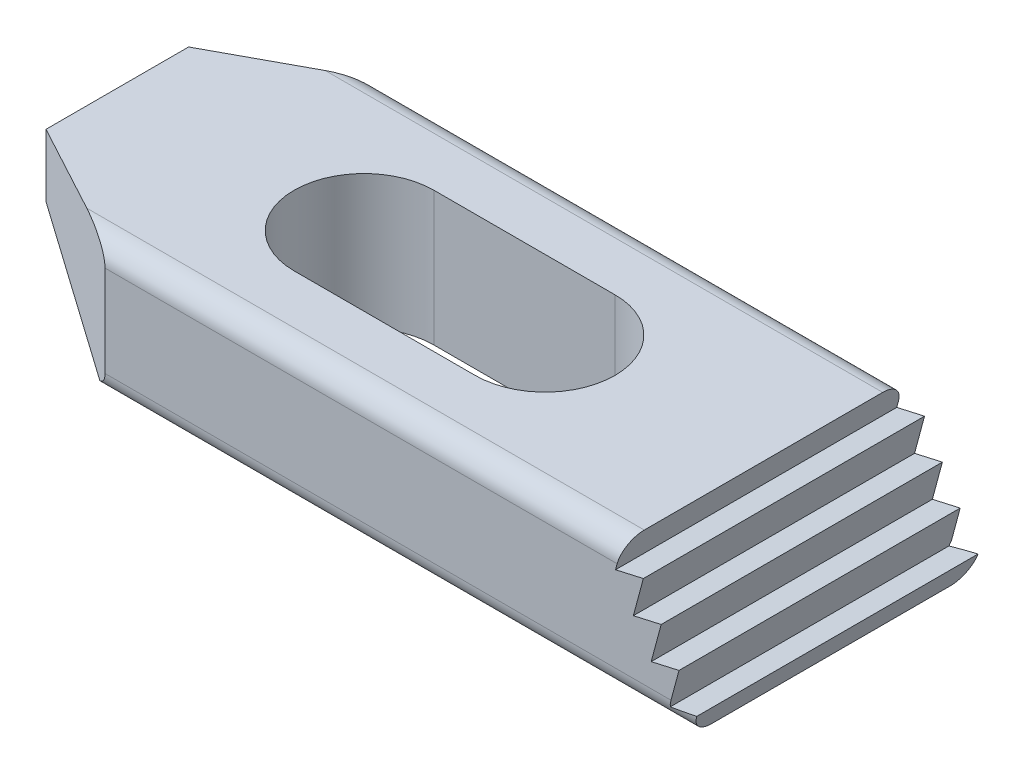
ISO-10303-21;
HEADER;
FILE_DESCRIPTION(('STEP AP214'),'2;1');
FILE_NAME('part.step','',(''),(''),'','','');
FILE_SCHEMA(('AUTOMOTIVE_DESIGN { 1 0 10303 214 1 1 1 1 }'));
ENDSEC;
DATA;
#1=APPLICATION_CONTEXT('core data for automotive mechanical design processes');
#2=APPLICATION_PROTOCOL_DEFINITION('international standard','automotive_design',2000,#1);
#3=PRODUCT_CONTEXT('',#1,'mechanical');
#4=PRODUCT('Part','Part','',(#3));
#5=PRODUCT_RELATED_PRODUCT_CATEGORY('part','',(#4));
#6=PRODUCT_DEFINITION_FORMATION('','',#4);
#7=PRODUCT_DEFINITION_CONTEXT('part definition',#1,'design');
#8=PRODUCT_DEFINITION('design','',#6,#7);
#9=PRODUCT_DEFINITION_SHAPE('','',#8);
#10=(LENGTH_UNIT() NAMED_UNIT(*) SI_UNIT(.MILLI.,.METRE.));
#11=(NAMED_UNIT(*) PLANE_ANGLE_UNIT() SI_UNIT($,.RADIAN.));
#12=(NAMED_UNIT(*) SI_UNIT($,.STERADIAN.) SOLID_ANGLE_UNIT());
#13=UNCERTAINTY_MEASURE_WITH_UNIT(LENGTH_MEASURE(1.E-05),#10,'distance_accuracy_value','');
#14=(GEOMETRIC_REPRESENTATION_CONTEXT(3) GLOBAL_UNCERTAINTY_ASSIGNED_CONTEXT((#13)) GLOBAL_UNIT_ASSIGNED_CONTEXT((#10,
#11,#12)) REPRESENTATION_CONTEXT('',''));
#15=CARTESIAN_POINT('',(0.,0.,0.));
#16=DIRECTION('',(0.,0.,1.));
#17=DIRECTION('',(1.,0.,0.));
#18=AXIS2_PLACEMENT_3D('',#15,#16,#17);
#19=CARTESIAN_POINT('',(-11.4766810133805,11.938,25.0444));
#20=DIRECTION('',(1.,0.,0.));
#21=DIRECTION('',(0.,0.,-1.));
#22=AXIS2_PLACEMENT_3D('',#19,#20,#21);
#23=PLANE('',#22);
#24=DIRECTION('',(0.,0.,-1.));
#25=VECTOR('',#24,1.);
#26=CARTESIAN_POINT('',(-11.4766810133805,11.938,25.0444));
#27=LINE('',#26,#25);
#28=CARTESIAN_POINT('',(-11.4766810133805,11.938,18.8722));
#29=VERTEX_POINT('',#28);
#30=CARTESIAN_POINT('',(-11.4766810133805,11.938,6.1722));
#31=VERTEX_POINT('',#30);
#32=EDGE_CURVE('E307',#29,#31,#27,.T.);
#33=ORIENTED_EDGE('',*,*,#32,.T.);
#34=DIRECTION('',(0.,1.,0.));
#35=VECTOR('',#34,1.);
#36=CARTESIAN_POINT('',(-11.4766810133805,0.,6.1722));
#37=LINE('',#36,#35);
#38=CARTESIAN_POINT('',(-11.4766810133805,6.35,6.1722));
#39=VERTEX_POINT('',#38);
#40=EDGE_CURVE('E231',#39,#31,#37,.T.);
#41=ORIENTED_EDGE('',*,*,#40,.F.);
#42=DIRECTION('',(0.,0.,-1.));
#43=VECTOR('',#42,1.);
#44=CARTESIAN_POINT('',(-11.4766810133805,6.35,25.0444));
#45=LINE('',#44,#43);
#46=CARTESIAN_POINT('',(-11.4766810133805,6.35,18.8722));
#47=VERTEX_POINT('',#46);
#48=EDGE_CURVE('E320',#47,#39,#45,.T.);
#49=ORIENTED_EDGE('',*,*,#48,.F.);
#50=DIRECTION('',(0.,1.,0.));
#51=VECTOR('',#50,1.);
#52=CARTESIAN_POINT('',(-11.4766810133805,0.,18.8722));
#53=LINE('',#52,#51);
#54=EDGE_CURVE('E244',#47,#29,#53,.T.);
#55=ORIENTED_EDGE('',*,*,#54,.T.);
#56=EDGE_LOOP('',(#33,#41,#49,#55));
#57=FACE_BOUND('',#56,.T.);
#58=ADVANCED_FACE('F41',(#57),#23,.F.);
#59=CARTESIAN_POINT('',(-11.4766810133805,6.35,25.0444));
#60=DIRECTION('',(0.48413130353903,0.874995360521185,0.));
#61=DIRECTION('',(-0.874995360521186,0.48413130353903,0.));
#62=AXIS2_PLACEMENT_3D('',#59,#60,#61);
#63=PLANE('',#62);
#64=DIRECTION('',(0.791129262943192,-0.437728539621538,-0.427209801989324));
#65=VECTOR('',#64,1.);
#66=CARTESIAN_POINT('',(-17.8550727421456,9.87913768627331,9.61653153353315));
#67=LINE('',#66,#65);
#68=CARTESIAN_POINT('',(-1.04401246590526,0.577647766873473,0.538558984363384));
#69=VERTEX_POINT('',#68);
#70=EDGE_CURVE('E237',#39,#69,#67,.T.);
#71=ORIENTED_EDGE('',*,*,#70,.T.);
#72=CARTESIAN_POINT('',(-3.44300430401414,1.905,1.905));
#73=DIRECTION('',(0.48413130353903,0.874995360521185,0.));
#74=DIRECTION('',(0.874995360521186,-0.48413130353903,0.));
#75=AXIS2_PLACEMENT_3D('',#72,#73,#74);
#76=ELLIPSE('',#75,3.9348829255087,1.905);
#77=CARTESIAN_POINT('',(0.,0.,1.905));
#78=VERTEX_POINT('',#77);
#79=EDGE_CURVE('E11',#69,#78,#76,.F.);
#80=ORIENTED_EDGE('',*,*,#79,.T.);
#81=DIRECTION('',(0.,0.,-1.));
#82=VECTOR('',#81,1.);
#83=CARTESIAN_POINT('',(0.,0.,25.0444));
#84=LINE('',#83,#82);
#85=CARTESIAN_POINT('',(0.,0.,23.1394));
#86=VERTEX_POINT('',#85);
#87=EDGE_CURVE('E317',#86,#78,#84,.T.);
#88=ORIENTED_EDGE('',*,*,#87,.F.);
#89=CARTESIAN_POINT('',(-3.44300430401414,1.905,23.1394));
#90=DIRECTION('',(0.48413130353903,0.874995360521185,0.));
#91=DIRECTION('',(-0.874995360521186,0.48413130353903,0.));
#92=AXIS2_PLACEMENT_3D('',#89,#90,#91);
#93=ELLIPSE('',#92,3.9348829255087,1.905);
#94=CARTESIAN_POINT('',(-1.04401246590526,0.577647766873472,24.5058410156366));
#95=VERTEX_POINT('',#94);
#96=EDGE_CURVE('E49',#86,#95,#93,.F.);
#97=ORIENTED_EDGE('',*,*,#96,.T.);
#98=DIRECTION('',(-0.791129262943192,0.437728539621538,-0.427209801989324));
#99=VECTOR('',#98,1.);
#100=CARTESIAN_POINT('',(-9.39061211689336,5.19578673248396,19.998677204103));
#101=LINE('',#100,#99);
#102=EDGE_CURVE('E252',#95,#47,#101,.T.);
#103=ORIENTED_EDGE('',*,*,#102,.T.);
#104=ORIENTED_EDGE('',*,*,#48,.T.);
#105=EDGE_LOOP('',(#71,#80,#88,#97,#103,#104));
#106=FACE_BOUND('',#105,.T.);
#107=ADVANCED_FACE('F376',(#106),#63,.F.);
#108=CARTESIAN_POINT('',(0.,0.,25.0444));
#109=DIRECTION('',(0.,1.,0.));
#110=DIRECTION('',(0.,0.,1.));
#111=AXIS2_PLACEMENT_3D('',#108,#109,#110);
#112=PLANE('',#111);
#113=DIRECTION('',(-1.,0.,0.));
#114=VECTOR('',#113,1.);
#115=CARTESIAN_POINT('',(10.4943189866195,0.,6.2992));
#116=LINE('',#115,#114);
#117=CARTESIAN_POINT('',(26.6233189866195,0.,6.2992));
#118=VERTEX_POINT('',#117);
#119=CARTESIAN_POINT('',(10.4943189866195,0.,6.2992));
#120=VERTEX_POINT('',#119);
#121=EDGE_CURVE('E208',#118,#120,#116,.T.);
#122=ORIENTED_EDGE('',*,*,#121,.T.);
#123=CARTESIAN_POINT('',(10.4943189866195,0.,12.5222));
#124=DIRECTION('',(0.,1.,0.));
#125=DIRECTION('',(0.,0.,1.));
#126=AXIS2_PLACEMENT_3D('',#123,#124,#125);
#127=CIRCLE('',#126,6.223);
#128=CARTESIAN_POINT('',(10.4943189866195,0.,18.7452));
#129=VERTEX_POINT('',#128);
#130=EDGE_CURVE('E200',#120,#129,#127,.T.);
#131=ORIENTED_EDGE('',*,*,#130,.T.);
#132=DIRECTION('',(1.,0.,0.));
#133=VECTOR('',#132,1.);
#134=CARTESIAN_POINT('',(10.4943189866195,0.,18.7452));
#135=LINE('',#134,#133);
#136=CARTESIAN_POINT('',(26.6233189866195,0.,18.7452));
#137=VERTEX_POINT('',#136);
#138=EDGE_CURVE('E212',#129,#137,#135,.T.);
#139=ORIENTED_EDGE('',*,*,#138,.T.);
#140=CARTESIAN_POINT('',(26.6233189866195,0.,12.5222));
#141=DIRECTION('',(0.,1.,0.));
#142=DIRECTION('',(0.,0.,1.));
#143=AXIS2_PLACEMENT_3D('',#140,#141,#142);
#144=CIRCLE('',#143,6.223);
#145=EDGE_CURVE('E216',#137,#118,#144,.T.);
#146=ORIENTED_EDGE('',*,*,#145,.T.);
#147=EDGE_LOOP('',(#122,#131,#139,#146));
#148=FACE_BOUND('',#147,.T.);
#149=ORIENTED_EDGE('',*,*,#87,.T.);
#150=DIRECTION('',(1.,0.,0.));
#151=VECTOR('',#150,1.);
#152=CARTESIAN_POINT('',(0.,0.,1.905));
#153=LINE('',#152,#151);
#154=CARTESIAN_POINT('',(52.07,0.,1.905));
#155=VERTEX_POINT('',#154);
#156=EDGE_CURVE('E360',#78,#155,#153,.T.);
#157=ORIENTED_EDGE('',*,*,#156,.T.);
#158=DIRECTION('',(0.,0.,-1.));
#159=VECTOR('',#158,1.);
#160=CARTESIAN_POINT('',(52.07,0.,25.0444));
#161=LINE('',#160,#159);
#162=CARTESIAN_POINT('',(52.07,0.,23.1394));
#163=VERTEX_POINT('',#162);
#164=EDGE_CURVE('E314',#163,#155,#161,.T.);
#165=ORIENTED_EDGE('',*,*,#164,.F.);
#166=DIRECTION('',(1.,0.,0.));
#167=VECTOR('',#166,1.);
#168=CARTESIAN_POINT('',(0.,0.,23.1394));
#169=LINE('',#168,#167);
#170=EDGE_CURVE('E358',#163,#86,#169,.F.);
#171=ORIENTED_EDGE('',*,*,#170,.T.);
#172=EDGE_LOOP('',(#149,#157,#165,#171));
#173=FACE_BOUND('',#172,.T.);
#174=ADVANCED_FACE('F218',(#148,#173),#112,.F.);
#175=CARTESIAN_POINT('',(52.07,0.,25.0444));
#176=DIRECTION('',(-0.951097335386373,0.308891337885899,0.));
#177=DIRECTION('',(-0.308891337885899,-0.951097335386373,0.));
#178=AXIS2_PLACEMENT_3D('',#175,#176,#177);
#179=PLANE('',#178);
#180=ORIENTED_EDGE('',*,*,#164,.T.);
#181=CARTESIAN_POINT('',(52.6886937727394,1.905,1.905));
#182=DIRECTION('',(-0.951097335386373,0.308891337885899,0.));
#183=DIRECTION('',(0.308891337885899,0.951097335386373,0.));
#184=AXIS2_PLACEMENT_3D('',#181,#182,#183);
#185=ELLIPSE('',#184,2.00294957111421,1.905);
#186=CARTESIAN_POINT('',(52.6583189866195,1.81147397774472,0.00229721628387455));
#187=VERTEX_POINT('',#186);
#188=EDGE_CURVE('E365',#155,#187,#185,.F.);
#189=ORIENTED_EDGE('',*,*,#188,.T.);
#190=DIRECTION('',(0.,0.,-1.));
#191=VECTOR('',#190,1.);
#192=CARTESIAN_POINT('',(52.6583189866195,1.81147397774472,25.0444));
#193=LINE('',#192,#191);
#194=CARTESIAN_POINT('',(52.6583189866195,1.81147397774472,25.0421027837161));
#195=VERTEX_POINT('',#194);
#196=EDGE_CURVE('E312',#195,#187,#193,.T.);
#197=ORIENTED_EDGE('',*,*,#196,.F.);
#198=CARTESIAN_POINT('',(52.6886937727394,1.905,23.1394));
#199=DIRECTION('',(-0.951097335386373,0.308891337885899,0.));
#200=DIRECTION('',(-0.308891337885899,-0.951097335386373,0.));
#201=AXIS2_PLACEMENT_3D('',#198,#199,#200);
#202=ELLIPSE('',#201,2.00294957111421,1.905);
#203=EDGE_CURVE('E363',#195,#163,#202,.F.);
#204=ORIENTED_EDGE('',*,*,#203,.T.);
#205=EDGE_LOOP('',(#180,#189,#197,#204));
#206=FACE_BOUND('',#205,.T.);
#207=ADVANCED_FACE('F443',(#206),#179,.F.);
#208=CARTESIAN_POINT('',(-11.4766810133805,11.938,25.0444));
#209=DIRECTION('',(0.,-1.,0.));
#210=DIRECTION('',(1.,0.,0.));
#211=AXIS2_PLACEMENT_3D('',#208,#209,#210);
#212=PLANE('',#211);
#213=DIRECTION('',(1.,0.,0.));
#214=VECTOR('',#213,1.);
#215=CARTESIAN_POINT('',(10.4943189866195,11.938,18.7452));
#216=LINE('',#215,#214);
#217=CARTESIAN_POINT('',(10.4943189866195,11.938,18.7452));
#218=VERTEX_POINT('',#217);
#219=CARTESIAN_POINT('',(26.6233189866195,11.938,18.7452));
#220=VERTEX_POINT('',#219);
#221=EDGE_CURVE('E230',#218,#220,#216,.T.);
#222=ORIENTED_EDGE('',*,*,#221,.F.);
#223=CARTESIAN_POINT('',(10.4943189866195,11.938,12.5222));
#224=DIRECTION('',(0.,1.,0.));
#225=DIRECTION('',(0.,0.,1.));
#226=AXIS2_PLACEMENT_3D('',#223,#224,#225);
#227=CIRCLE('',#226,6.223);
#228=CARTESIAN_POINT('',(10.4943189866195,11.938,6.2992));
#229=VERTEX_POINT('',#228);
#230=EDGE_CURVE('E203',#229,#218,#227,.T.);
#231=ORIENTED_EDGE('',*,*,#230,.F.);
#232=DIRECTION('',(-1.,0.,0.));
#233=VECTOR('',#232,1.);
#234=CARTESIAN_POINT('',(10.4943189866195,11.938,6.2992));
#235=LINE('',#234,#233);
#236=CARTESIAN_POINT('',(26.6233189866195,11.938,6.2992));
#237=VERTEX_POINT('',#236);
#238=EDGE_CURVE('E221',#237,#229,#235,.T.);
#239=ORIENTED_EDGE('',*,*,#238,.F.);
#240=CARTESIAN_POINT('',(26.6233189866195,11.938,12.5222));
#241=DIRECTION('',(0.,1.,0.));
#242=DIRECTION('',(0.,0.,1.));
#243=AXIS2_PLACEMENT_3D('',#240,#241,#242);
#244=CIRCLE('',#243,6.223);
#245=EDGE_CURVE('E224',#220,#237,#244,.T.);
#246=ORIENTED_EDGE('',*,*,#245,.F.);
#247=EDGE_LOOP('',(#222,#231,#239,#246));
#248=FACE_BOUND('',#247,.T.);
#249=DIRECTION('',(-0.879905397657192,0.,-0.475148914734884));
#250=VECTOR('',#249,1.);
#251=CARTESIAN_POINT('',(-11.4766810133805,11.938,18.8722));
#252=LINE('',#251,#250);
#253=CARTESIAN_POINT('',(-3.57445879115825,11.938,23.1394));
#254=VERTEX_POINT('',#253);
#255=EDGE_CURVE('E246',#254,#29,#252,.T.);
#256=ORIENTED_EDGE('',*,*,#255,.F.);
#257=DIRECTION('',(-1.,0.,0.));
#258=VECTOR('',#257,1.);
#259=CARTESIAN_POINT('',(46.0740865722484,11.938,23.1394));
#260=LINE('',#259,#258);
#261=CARTESIAN_POINT('',(46.0740865722484,11.938,23.1394));
#262=VERTEX_POINT('',#261);
#263=EDGE_CURVE('E344',#254,#262,#260,.F.);
#264=ORIENTED_EDGE('',*,*,#263,.T.);
#265=DIRECTION('',(0.,0.,-1.));
#266=VECTOR('',#265,1.);
#267=CARTESIAN_POINT('',(46.0740865722484,11.938,25.0444));
#268=LINE('',#267,#266);
#269=CARTESIAN_POINT('',(46.0740865722484,11.938,1.905));
#270=VERTEX_POINT('',#269);
#271=EDGE_CURVE('E285',#262,#270,#268,.T.);
#272=ORIENTED_EDGE('',*,*,#271,.T.);
#273=DIRECTION('',(-1.,0.,0.));
#274=VECTOR('',#273,1.);
#275=CARTESIAN_POINT('',(-11.4766810133805,11.938,1.905));
#276=LINE('',#275,#274);
#277=CARTESIAN_POINT('',(-3.57445879115825,11.938,1.905));
#278=VERTEX_POINT('',#277);
#279=EDGE_CURVE('E341',#270,#278,#276,.T.);
#280=ORIENTED_EDGE('',*,*,#279,.T.);
#281=DIRECTION('',(0.879905397657192,0.,-0.475148914734884));
#282=VECTOR('',#281,1.);
#283=CARTESIAN_POINT('',(-11.4766810133805,11.938,6.1722));
#284=LINE('',#283,#282);
#285=EDGE_CURVE('E241',#31,#278,#284,.T.);
#286=ORIENTED_EDGE('',*,*,#285,.F.);
#287=ORIENTED_EDGE('',*,*,#32,.F.);
#288=EDGE_LOOP('',(#256,#264,#272,#280,#286,#287));
#289=FACE_BOUND('',#288,.T.);
#290=ADVANCED_FACE('F429',(#248,#289),#212,.F.);
#291=CARTESIAN_POINT('',(0.,0.,25.0444));
#292=DIRECTION('',(0.,0.,1.));
#293=DIRECTION('',(1.,0.,0.));
#294=AXIS2_PLACEMENT_3D('',#291,#292,#293);
#295=PLANE('',#294);
#296=DIRECTION('',(-0.259420015630723,-0.965764596312246,0.));
#297=VECTOR('',#296,1.);
#298=CARTESIAN_POINT('',(46.3083189866196,12.8099966058071,25.0444));
#299=LINE('',#298,#297);
#300=CARTESIAN_POINT('',(45.5623727118899,10.033,25.0444));
#301=VERTEX_POINT('',#300);
#302=CARTESIAN_POINT('',(45.4187677530218,9.49838980505241,25.0444));
#303=VERTEX_POINT('',#302);
#304=EDGE_CURVE('E268',#301,#303,#299,.T.);
#305=ORIENTED_EDGE('',*,*,#304,.F.);
#306=DIRECTION('',(-1.,0.,0.));
#307=VECTOR('',#306,1.);
#308=CARTESIAN_POINT('',(-0.0466810133804687,10.033,25.0444));
#309=LINE('',#308,#307);
#310=CARTESIAN_POINT('',(-0.0466810133804665,10.033,25.0444));
#311=VERTEX_POINT('',#310);
#312=EDGE_CURVE('E334',#301,#311,#309,.T.);
#313=ORIENTED_EDGE('',*,*,#312,.T.);
#314=DIRECTION('',(0.,1.,0.));
#315=VECTOR('',#314,1.);
#316=CARTESIAN_POINT('',(-0.0466810133804665,0.,25.0444));
#317=LINE('',#316,#315);
#318=CARTESIAN_POINT('',(-0.0466810133804665,1.905,25.0444));
#319=VERTEX_POINT('',#318);
#320=EDGE_CURVE('E328',#319,#311,#317,.T.);
#321=ORIENTED_EDGE('',*,*,#320,.F.);
#322=DIRECTION('',(1.,0.,0.));
#323=VECTOR('',#322,1.);
#324=CARTESIAN_POINT('',(52.07,1.905,25.0444));
#325=LINE('',#324,#323);
#326=CARTESIAN_POINT('',(50.3573462537222,1.905,25.0444));
#327=VERTEX_POINT('',#326);
#328=EDGE_CURVE('E331',#319,#327,#325,.T.);
#329=ORIENTED_EDGE('',*,*,#328,.T.);
#330=DIRECTION('',(-0.259420015630723,-0.965764596312246,0.));
#331=VECTOR('',#330,1.);
#332=CARTESIAN_POINT('',(51.0708189866195,4.56110463476032,25.0444));
#333=LINE('',#332,#331);
#334=CARTESIAN_POINT('',(51.0708189866195,4.56110463476032,25.0444));
#335=VERTEX_POINT('',#334);
#336=EDGE_CURVE('E299',#335,#327,#333,.T.);
#337=ORIENTED_EDGE('',*,*,#336,.F.);
#338=DIRECTION('',(0.975217021101476,0.221250450290983,0.));
#339=VECTOR('',#338,1.);
#340=CARTESIAN_POINT('',(48.5937677530218,3.99912849102122,25.0444));
#341=LINE('',#340,#339);
#342=CARTESIAN_POINT('',(48.5937677530218,3.99912849102122,25.0444));
#343=VERTEX_POINT('',#342);
#344=EDGE_CURVE('E274',#343,#335,#341,.T.);
#345=ORIENTED_EDGE('',*,*,#344,.F.);
#346=DIRECTION('',(-0.259420015630723,-0.965764596312246,0.));
#347=VECTOR('',#346,1.);
#348=CARTESIAN_POINT('',(49.4833189866196,7.31073529177591,25.0444));
#349=LINE('',#348,#347);
#350=CARTESIAN_POINT('',(49.4833189866196,7.31073529177591,25.0444));
#351=VERTEX_POINT('',#350);
#352=EDGE_CURVE('E278',#351,#343,#349,.T.);
#353=ORIENTED_EDGE('',*,*,#352,.F.);
#354=DIRECTION('',(0.975217021101476,0.221250450290983,0.));
#355=VECTOR('',#354,1.);
#356=CARTESIAN_POINT('',(47.0062677530218,6.74875914803682,25.0444));
#357=LINE('',#356,#355);
#358=CARTESIAN_POINT('',(47.0062677530218,6.74875914803682,25.0444));
#359=VERTEX_POINT('',#358);
#360=EDGE_CURVE('E259',#359,#351,#357,.T.);
#361=ORIENTED_EDGE('',*,*,#360,.F.);
#362=DIRECTION('',(-0.259420015630723,-0.965764596312246,0.));
#363=VECTOR('',#362,1.);
#364=CARTESIAN_POINT('',(47.8958189866196,10.0603659487915,25.0444));
#365=LINE('',#364,#363);
#366=CARTESIAN_POINT('',(47.8958189866196,10.0603659487915,25.0444));
#367=VERTEX_POINT('',#366);
#368=EDGE_CURVE('E254',#367,#359,#365,.T.);
#369=ORIENTED_EDGE('',*,*,#368,.F.);
#370=DIRECTION('',(0.975217021101476,0.221250450290983,0.));
#371=VECTOR('',#370,1.);
#372=CARTESIAN_POINT('',(45.4187677530218,9.49838980505241,25.0444));
#373=LINE('',#372,#371);
#374=EDGE_CURVE('E291',#303,#367,#373,.T.);
#375=ORIENTED_EDGE('',*,*,#374,.F.);
#376=EDGE_LOOP('',(#305,#313,#321,#329,#337,#345,#353,#361,#369,#375));
#377=FACE_BOUND('',#376,.T.);
#378=ADVANCED_FACE('F390',(#377),#295,.T.);
#379=CARTESIAN_POINT('',(0.,0.,0.));
#380=DIRECTION('',(0.,0.,1.));
#381=DIRECTION('',(1.,0.,0.));
#382=AXIS2_PLACEMENT_3D('',#379,#380,#381);
#383=PLANE('',#382);
#384=DIRECTION('',(0.,1.,0.));
#385=VECTOR('',#384,1.);
#386=CARTESIAN_POINT('',(-0.0466810133804665,0.,0.));
#387=LINE('',#386,#385);
#388=CARTESIAN_POINT('',(-0.0466810133804665,1.905,0.));
#389=VERTEX_POINT('',#388);
#390=CARTESIAN_POINT('',(-0.0466810133804665,10.033,0.));
#391=VERTEX_POINT('',#390);
#392=EDGE_CURVE('E325',#389,#391,#387,.T.);
#393=ORIENTED_EDGE('',*,*,#392,.T.);
#394=DIRECTION('',(-1.,0.,0.));
#395=VECTOR('',#394,1.);
#396=CARTESIAN_POINT('',(0.,10.033,0.));
#397=LINE('',#396,#395);
#398=CARTESIAN_POINT('',(45.5623727118899,10.033,0.));
#399=VERTEX_POINT('',#398);
#400=EDGE_CURVE('E356',#391,#399,#397,.F.);
#401=ORIENTED_EDGE('',*,*,#400,.T.);
#402=DIRECTION('',(-0.259420015630723,-0.965764596312246,0.));
#403=VECTOR('',#402,1.);
#404=CARTESIAN_POINT('',(39.9824277887807,-10.7399278059332,0.));
#405=LINE('',#404,#403);
#406=CARTESIAN_POINT('',(45.4187677530218,9.49838980505241,0.));
#407=VERTEX_POINT('',#406);
#408=EDGE_CURVE('E323',#399,#407,#405,.T.);
#409=ORIENTED_EDGE('',*,*,#408,.T.);
#410=DIRECTION('',(0.975217021101476,0.221250450290983,0.));
#411=VECTOR('',#410,1.);
#412=CARTESIAN_POINT('',(45.4187677530218,9.49838980505241,0.));
#413=LINE('',#412,#411);
#414=CARTESIAN_POINT('',(47.8958189866196,10.0603659487915,0.));
#415=VERTEX_POINT('',#414);
#416=EDGE_CURVE('E288',#407,#415,#413,.T.);
#417=ORIENTED_EDGE('',*,*,#416,.T.);
#418=DIRECTION('',(-0.259420015630723,-0.965764596312246,0.));
#419=VECTOR('',#418,1.);
#420=CARTESIAN_POINT('',(47.8958189866196,10.0603659487915,0.));
#421=LINE('',#420,#419);
#422=CARTESIAN_POINT('',(47.0062677530218,6.74875914803682,0.));
#423=VERTEX_POINT('',#422);
#424=EDGE_CURVE('E255',#415,#423,#421,.T.);
#425=ORIENTED_EDGE('',*,*,#424,.T.);
#426=DIRECTION('',(0.975217021101476,0.221250450290983,0.));
#427=VECTOR('',#426,1.);
#428=CARTESIAN_POINT('',(47.0062677530218,6.74875914803682,0.));
#429=LINE('',#428,#427);
#430=CARTESIAN_POINT('',(49.4833189866196,7.31073529177591,0.));
#431=VERTEX_POINT('',#430);
#432=EDGE_CURVE('E258',#423,#431,#429,.T.);
#433=ORIENTED_EDGE('',*,*,#432,.T.);
#434=DIRECTION('',(-0.259420015630723,-0.965764596312246,0.));
#435=VECTOR('',#434,1.);
#436=CARTESIAN_POINT('',(49.4833189866196,7.31073529177591,0.));
#437=LINE('',#436,#435);
#438=CARTESIAN_POINT('',(48.5937677530218,3.99912849102122,0.));
#439=VERTEX_POINT('',#438);
#440=EDGE_CURVE('E270',#431,#439,#437,.T.);
#441=ORIENTED_EDGE('',*,*,#440,.T.);
#442=DIRECTION('',(0.975217021101476,0.221250450290983,0.));
#443=VECTOR('',#442,1.);
#444=CARTESIAN_POINT('',(48.5937677530218,3.99912849102122,0.));
#445=LINE('',#444,#443);
#446=CARTESIAN_POINT('',(51.0708189866195,4.56110463476032,0.));
#447=VERTEX_POINT('',#446);
#448=EDGE_CURVE('E273',#439,#447,#445,.T.);
#449=ORIENTED_EDGE('',*,*,#448,.T.);
#450=DIRECTION('',(-0.259420015630723,-0.965764596312246,0.));
#451=VECTOR('',#450,1.);
#452=CARTESIAN_POINT('',(51.0708189866195,4.56110463476032,0.));
#453=LINE('',#452,#451);
#454=CARTESIAN_POINT('',(50.3573462537222,1.905,0.));
#455=VERTEX_POINT('',#454);
#456=EDGE_CURVE('E300',#447,#455,#453,.T.);
#457=ORIENTED_EDGE('',*,*,#456,.T.);
#458=DIRECTION('',(1.,0.,0.));
#459=VECTOR('',#458,1.);
#460=CARTESIAN_POINT('',(0.,1.905,0.));
#461=LINE('',#460,#459);
#462=EDGE_CURVE('E354',#455,#389,#461,.F.);
#463=ORIENTED_EDGE('',*,*,#462,.T.);
#464=EDGE_LOOP('',(#393,#401,#409,#417,#425,#433,#441,#449,#457,#463));
#465=FACE_BOUND('',#464,.T.);
#466=ADVANCED_FACE('F398',(#465),#383,.F.);
#467=CARTESIAN_POINT('',(50.1812677530218,1.24949783400563,0.));
#468=DIRECTION('',(0.221250450290983,-0.975217021101476,0.));
#469=DIRECTION('',(0.975217021101477,0.221250450290983,0.));
#470=AXIS2_PLACEMENT_3D('',#467,#468,#469);
#471=PLANE('',#470);
#472=ORIENTED_EDGE('',*,*,#196,.T.);
#473=CARTESIAN_POINT('',(53.0705584586717,1.905,1.905));
#474=DIRECTION('',(0.221250450290983,-0.975217021101476,0.));
#475=DIRECTION('',(0.975217021101476,0.221250450290983,0.));
#476=AXIS2_PLACEMENT_3D('',#473,#474,#475);
#477=ELLIPSE('',#476,8.61015196802807,1.905);
#478=CARTESIAN_POINT('',(50.1812677530218,1.24949783400563,0.116329569099806));
#479=VERTEX_POINT('',#478);
#480=EDGE_CURVE('E63',#187,#479,#477,.F.);
#481=ORIENTED_EDGE('',*,*,#480,.T.);
#482=DIRECTION('',(0.,0.,1.));
#483=VECTOR('',#482,1.);
#484=CARTESIAN_POINT('',(50.1812677530218,1.24949783400563,0.));
#485=LINE('',#484,#483);
#486=CARTESIAN_POINT('',(50.1812677530218,1.24949783400563,24.9280704309002));
#487=VERTEX_POINT('',#486);
#488=EDGE_CURVE('E305',#479,#487,#485,.T.);
#489=ORIENTED_EDGE('',*,*,#488,.T.);
#490=CARTESIAN_POINT('',(53.0705584586717,1.905,23.1394));
#491=DIRECTION('',(0.221250450290983,-0.975217021101476,0.));
#492=DIRECTION('',(-0.975217021101476,-0.221250450290983,0.));
#493=AXIS2_PLACEMENT_3D('',#490,#491,#492);
#494=ELLIPSE('',#493,8.61015196802807,1.905);
#495=EDGE_CURVE('E367',#487,#195,#494,.F.);
#496=ORIENTED_EDGE('',*,*,#495,.T.);
#497=EDGE_LOOP('',(#472,#481,#489,#496));
#498=FACE_BOUND('',#497,.T.);
#499=ADVANCED_FACE('F446',(#498),#471,.F.);
#500=CARTESIAN_POINT('',(51.0708189866195,4.56110463476032,0.));
#501=DIRECTION('',(-0.965764596312246,0.259420015630723,0.));
#502=DIRECTION('',(-0.259420015630723,-0.965764596312246,0.));
#503=AXIS2_PLACEMENT_3D('',#500,#501,#502);
#504=PLANE('',#503);
#505=ORIENTED_EDGE('',*,*,#488,.F.);
#506=CARTESIAN_POINT('',(50.3573462537222,1.905,1.905));
#507=DIRECTION('',(-0.965764596312246,0.259420015630723,0.));
#508=DIRECTION('',(0.259420015630723,0.965764596312246,0.));
#509=AXIS2_PLACEMENT_3D('',#506,#507,#508);
#510=ELLIPSE('',#509,1.97253037362749,1.905);
#511=EDGE_CURVE('E371',#479,#455,#510,.F.);
#512=ORIENTED_EDGE('',*,*,#511,.T.);
#513=ORIENTED_EDGE('',*,*,#456,.F.);
#514=DIRECTION('',(0.,0.,1.));
#515=VECTOR('',#514,1.);
#516=CARTESIAN_POINT('',(51.0708189866195,4.56110463476032,0.));
#517=LINE('',#516,#515);
#518=EDGE_CURVE('E303',#447,#335,#517,.T.);
#519=ORIENTED_EDGE('',*,*,#518,.T.);
#520=ORIENTED_EDGE('',*,*,#336,.T.);
#521=CARTESIAN_POINT('',(50.3573462537222,1.905,23.1394));
#522=DIRECTION('',(-0.965764596312246,0.259420015630723,0.));
#523=DIRECTION('',(-0.259420015630723,-0.965764596312246,0.));
#524=AXIS2_PLACEMENT_3D('',#521,#522,#523);
#525=ELLIPSE('',#524,1.97253037362749,1.905);
#526=EDGE_CURVE('E56',#327,#487,#525,.F.);
#527=ORIENTED_EDGE('',*,*,#526,.T.);
#528=EDGE_LOOP('',(#505,#512,#513,#519,#520,#527));
#529=FACE_BOUND('',#528,.T.);
#530=ADVANCED_FACE('F392',(#529),#504,.F.);
#531=CARTESIAN_POINT('',(48.5937677530218,3.99912849102122,0.));
#532=DIRECTION('',(0.221250450290983,-0.975217021101476,0.));
#533=DIRECTION('',(0.975217021101477,0.221250450290983,0.));
#534=AXIS2_PLACEMENT_3D('',#531,#532,#533);
#535=PLANE('',#534);
#536=ORIENTED_EDGE('',*,*,#344,.T.);
#537=ORIENTED_EDGE('',*,*,#518,.F.);
#538=ORIENTED_EDGE('',*,*,#448,.F.);
#539=DIRECTION('',(0.,0.,1.));
#540=VECTOR('',#539,1.);
#541=CARTESIAN_POINT('',(48.5937677530218,3.99912849102122,0.));
#542=LINE('',#541,#540);
#543=EDGE_CURVE('E283',#439,#343,#542,.T.);
#544=ORIENTED_EDGE('',*,*,#543,.T.);
#545=EDGE_LOOP('',(#536,#537,#538,#544));
#546=FACE_BOUND('',#545,.T.);
#547=ADVANCED_FACE('F396',(#546),#535,.F.);
#548=CARTESIAN_POINT('',(49.4833189866196,7.31073529177591,0.));
#549=DIRECTION('',(-0.965764596312246,0.259420015630723,0.));
#550=DIRECTION('',(-0.259420015630723,-0.965764596312246,0.));
#551=AXIS2_PLACEMENT_3D('',#548,#549,#550);
#552=PLANE('',#551);
#553=ORIENTED_EDGE('',*,*,#352,.T.);
#554=ORIENTED_EDGE('',*,*,#543,.F.);
#555=ORIENTED_EDGE('',*,*,#440,.F.);
#556=DIRECTION('',(0.,0.,1.));
#557=VECTOR('',#556,1.);
#558=CARTESIAN_POINT('',(49.4833189866196,7.31073529177591,0.));
#559=LINE('',#558,#557);
#560=EDGE_CURVE('E277',#431,#351,#559,.T.);
#561=ORIENTED_EDGE('',*,*,#560,.T.);
#562=EDGE_LOOP('',(#553,#554,#555,#561));
#563=FACE_BOUND('',#562,.T.);
#564=ADVANCED_FACE('F403',(#563),#552,.F.);
#565=CARTESIAN_POINT('',(46.3083189866196,12.8099966058071,0.));
#566=DIRECTION('',(-0.965764596312246,0.259420015630723,0.));
#567=DIRECTION('',(-0.259420015630723,-0.965764596312246,0.));
#568=AXIS2_PLACEMENT_3D('',#565,#566,#567);
#569=PLANE('',#568);
#570=ORIENTED_EDGE('',*,*,#271,.F.);
#571=CARTESIAN_POINT('',(45.5623727118899,10.033,23.1394));
#572=DIRECTION('',(-0.965764596312246,0.259420015630723,0.));
#573=DIRECTION('',(0.259420015630723,0.965764596312246,0.));
#574=AXIS2_PLACEMENT_3D('',#571,#572,#573);
#575=ELLIPSE('',#574,1.97253037362749,1.905);
#576=EDGE_CURVE('E348',#262,#301,#575,.F.);
#577=ORIENTED_EDGE('',*,*,#576,.T.);
#578=ORIENTED_EDGE('',*,*,#304,.T.);
#579=DIRECTION('',(0.,0.,1.));
#580=VECTOR('',#579,1.);
#581=CARTESIAN_POINT('',(45.4187677530218,9.49838980505241,0.));
#582=LINE('',#581,#580);
#583=EDGE_CURVE('E281',#407,#303,#582,.T.);
#584=ORIENTED_EDGE('',*,*,#583,.F.);
#585=ORIENTED_EDGE('',*,*,#408,.F.);
#586=CARTESIAN_POINT('',(45.5623727118899,10.033,1.905));
#587=DIRECTION('',(-0.965764596312246,0.259420015630723,0.));
#588=DIRECTION('',(-0.259420015630723,-0.965764596312246,0.));
#589=AXIS2_PLACEMENT_3D('',#586,#587,#588);
#590=ELLIPSE('',#589,1.97253037362749,1.905);
#591=EDGE_CURVE('E346',#399,#270,#590,.F.);
#592=ORIENTED_EDGE('',*,*,#591,.T.);
#593=EDGE_LOOP('',(#570,#577,#578,#584,#585,#592));
#594=FACE_BOUND('',#593,.T.);
#595=ADVANCED_FACE('F422',(#594),#569,.F.);
#596=CARTESIAN_POINT('',(45.4187677530218,9.49838980505241,0.));
#597=DIRECTION('',(0.221250450290983,-0.975217021101476,0.));
#598=DIRECTION('',(0.975217021101477,0.221250450290983,0.));
#599=AXIS2_PLACEMENT_3D('',#596,#597,#598);
#600=PLANE('',#599);
#601=ORIENTED_EDGE('',*,*,#374,.T.);
#602=DIRECTION('',(0.,0.,1.));
#603=VECTOR('',#602,1.);
#604=CARTESIAN_POINT('',(47.8958189866196,10.0603659487915,0.));
#605=LINE('',#604,#603);
#606=EDGE_CURVE('E262',#415,#367,#605,.T.);
#607=ORIENTED_EDGE('',*,*,#606,.F.);
#608=ORIENTED_EDGE('',*,*,#416,.F.);
#609=ORIENTED_EDGE('',*,*,#583,.T.);
#610=EDGE_LOOP('',(#601,#607,#608,#609));
#611=FACE_BOUND('',#610,.T.);
#612=ADVANCED_FACE('F415',(#611),#600,.F.);
#613=CARTESIAN_POINT('',(47.0062677530218,6.74875914803682,0.));
#614=DIRECTION('',(0.221250450290983,-0.975217021101476,0.));
#615=DIRECTION('',(0.975217021101477,0.221250450290983,0.));
#616=AXIS2_PLACEMENT_3D('',#613,#614,#615);
#617=PLANE('',#616);
#618=ORIENTED_EDGE('',*,*,#360,.T.);
#619=ORIENTED_EDGE('',*,*,#560,.F.);
#620=ORIENTED_EDGE('',*,*,#432,.F.);
#621=DIRECTION('',(0.,0.,1.));
#622=VECTOR('',#621,1.);
#623=CARTESIAN_POINT('',(47.0062677530218,6.74875914803682,0.));
#624=LINE('',#623,#622);
#625=EDGE_CURVE('E266',#423,#359,#624,.T.);
#626=ORIENTED_EDGE('',*,*,#625,.T.);
#627=EDGE_LOOP('',(#618,#619,#620,#626));
#628=FACE_BOUND('',#627,.T.);
#629=ADVANCED_FACE('F409',(#628),#617,.F.);
#630=CARTESIAN_POINT('',(47.8958189866196,10.0603659487915,0.));
#631=DIRECTION('',(-0.965764596312246,0.259420015630723,0.));
#632=DIRECTION('',(-0.259420015630723,-0.965764596312246,0.));
#633=AXIS2_PLACEMENT_3D('',#630,#631,#632);
#634=PLANE('',#633);
#635=ORIENTED_EDGE('',*,*,#368,.T.);
#636=ORIENTED_EDGE('',*,*,#625,.F.);
#637=ORIENTED_EDGE('',*,*,#424,.F.);
#638=ORIENTED_EDGE('',*,*,#606,.T.);
#639=EDGE_LOOP('',(#635,#636,#637,#638));
#640=FACE_BOUND('',#639,.T.);
#641=ADVANCED_FACE('F411',(#640),#634,.F.);
#642=CARTESIAN_POINT('',(-11.4766810133805,0.,6.1722));
#643=DIRECTION('',(0.475148914734884,0.,0.879905397657193));
#644=DIRECTION('',(0.879905397657193,0.,-0.475148914734884));
#645=AXIS2_PLACEMENT_3D('',#642,#643,#644);
#646=PLANE('',#645);
#647=ORIENTED_EDGE('',*,*,#285,.T.);
#648=CARTESIAN_POINT('',(-3.57445879115825,10.033,1.905));
#649=DIRECTION('',(0.475148914734884,0.,0.879905397657193));
#650=DIRECTION('',(-0.879905397657193,0.,0.475148914734884));
#651=AXIS2_PLACEMENT_3D('',#648,#649,#650);
#652=ELLIPSE('',#651,4.00926939097172,1.905);
#653=EDGE_CURVE('E352',#278,#391,#652,.F.);
#654=ORIENTED_EDGE('',*,*,#653,.T.);
#655=ORIENTED_EDGE('',*,*,#392,.F.);
#656=CARTESIAN_POINT('',(-3.57445879115825,1.905,1.905));
#657=DIRECTION('',(0.475148914734884,0.,0.879905397657193));
#658=DIRECTION('',(0.879905397657193,0.,-0.475148914734884));
#659=AXIS2_PLACEMENT_3D('',#656,#657,#658);
#660=ELLIPSE('',#659,4.00926939097172,1.905);
#661=EDGE_CURVE('E350',#389,#69,#660,.F.);
#662=ORIENTED_EDGE('',*,*,#661,.T.);
#663=ORIENTED_EDGE('',*,*,#70,.F.);
#664=ORIENTED_EDGE('',*,*,#40,.T.);
#665=EDGE_LOOP('',(#647,#654,#655,#662,#663,#664));
#666=FACE_BOUND('',#665,.T.);
#667=ADVANCED_FACE('F432',(#666),#646,.F.);
#668=CARTESIAN_POINT('',(-11.4766810133805,0.,18.8722));
#669=DIRECTION('',(0.475148914734884,0.,-0.879905397657193));
#670=DIRECTION('',(-0.879905397657193,0.,-0.475148914734884));
#671=AXIS2_PLACEMENT_3D('',#668,#669,#670);
#672=PLANE('',#671);
#673=ORIENTED_EDGE('',*,*,#320,.T.);
#674=CARTESIAN_POINT('',(-3.57445879115825,10.033,23.1394));
#675=DIRECTION('',(0.475148914734884,0.,-0.879905397657193));
#676=DIRECTION('',(0.879905397657193,0.,0.475148914734884));
#677=AXIS2_PLACEMENT_3D('',#674,#675,#676);
#678=ELLIPSE('',#677,4.00926939097172,1.905);
#679=EDGE_CURVE('E339',#311,#254,#678,.F.);
#680=ORIENTED_EDGE('',*,*,#679,.T.);
#681=ORIENTED_EDGE('',*,*,#255,.T.);
#682=ORIENTED_EDGE('',*,*,#54,.F.);
#683=ORIENTED_EDGE('',*,*,#102,.F.);
#684=CARTESIAN_POINT('',(-3.57445879115825,1.905,23.1394));
#685=DIRECTION('',(0.475148914734884,0.,-0.879905397657193));
#686=DIRECTION('',(-0.879905397657193,0.,-0.475148914734884));
#687=AXIS2_PLACEMENT_3D('',#684,#685,#686);
#688=ELLIPSE('',#687,4.00926939097172,1.905);
#689=EDGE_CURVE('E337',#95,#319,#688,.F.);
#690=ORIENTED_EDGE('',*,*,#689,.T.);
#691=EDGE_LOOP('',(#673,#680,#681,#682,#683,#690));
#692=FACE_BOUND('',#691,.T.);
#693=ADVANCED_FACE('F382',(#692),#672,.F.);
#694=CARTESIAN_POINT('',(10.4943189866195,0.,12.5222));
#695=DIRECTION('',(0.,1.,0.));
#696=DIRECTION('',(0.,0.,1.));
#697=AXIS2_PLACEMENT_3D('',#694,#695,#696);
#698=CYLINDRICAL_SURFACE('',#697,6.223);
#699=ORIENTED_EDGE('',*,*,#230,.T.);
#700=DIRECTION('',(0.,1.,0.));
#701=VECTOR('',#700,1.);
#702=CARTESIAN_POINT('',(10.4943189866195,0.,18.7452));
#703=LINE('',#702,#701);
#704=EDGE_CURVE('E196',#129,#218,#703,.T.);
#705=ORIENTED_EDGE('',*,*,#704,.F.);
#706=ORIENTED_EDGE('',*,*,#130,.F.);
#707=DIRECTION('',(0.,1.,0.));
#708=VECTOR('',#707,1.);
#709=CARTESIAN_POINT('',(10.4943189866195,0.,6.2992));
#710=LINE('',#709,#708);
#711=EDGE_CURVE('E235',#120,#229,#710,.T.);
#712=ORIENTED_EDGE('',*,*,#711,.T.);
#713=EDGE_LOOP('',(#699,#705,#706,#712));
#714=FACE_BOUND('',#713,.T.);
#715=ADVANCED_FACE('F198',(#714),#698,.F.);
#716=CARTESIAN_POINT('',(10.4943189866195,0.,6.2992));
#717=DIRECTION('',(0.,0.,-1.));
#718=DIRECTION('',(-1.,0.,0.));
#719=AXIS2_PLACEMENT_3D('',#716,#717,#718);
#720=PLANE('',#719);
#721=ORIENTED_EDGE('',*,*,#238,.T.);
#722=ORIENTED_EDGE('',*,*,#711,.F.);
#723=ORIENTED_EDGE('',*,*,#121,.F.);
#724=DIRECTION('',(0.,1.,0.));
#725=VECTOR('',#724,1.);
#726=CARTESIAN_POINT('',(26.6233189866195,0.,6.2992));
#727=LINE('',#726,#725);
#728=EDGE_CURVE('E238',#118,#237,#727,.T.);
#729=ORIENTED_EDGE('',*,*,#728,.T.);
#730=EDGE_LOOP('',(#721,#722,#723,#729));
#731=FACE_BOUND('',#730,.T.);
#732=ADVANCED_FACE('F503',(#731),#720,.F.);
#733=CARTESIAN_POINT('',(26.6233189866195,0.,12.5222));
#734=DIRECTION('',(0.,1.,0.));
#735=DIRECTION('',(0.,0.,1.));
#736=AXIS2_PLACEMENT_3D('',#733,#734,#735);
#737=CYLINDRICAL_SURFACE('',#736,6.223);
#738=ORIENTED_EDGE('',*,*,#245,.T.);
#739=ORIENTED_EDGE('',*,*,#728,.F.);
#740=ORIENTED_EDGE('',*,*,#145,.F.);
#741=DIRECTION('',(0.,1.,0.));
#742=VECTOR('',#741,1.);
#743=CARTESIAN_POINT('',(26.6233189866195,0.,18.7452));
#744=LINE('',#743,#742);
#745=EDGE_CURVE('E207',#137,#220,#744,.T.);
#746=ORIENTED_EDGE('',*,*,#745,.T.);
#747=EDGE_LOOP('',(#738,#739,#740,#746));
#748=FACE_BOUND('',#747,.T.);
#749=ADVANCED_FACE('F496',(#748),#737,.F.);
#750=CARTESIAN_POINT('',(10.4943189866195,0.,18.7452));
#751=DIRECTION('',(0.,0.,1.));
#752=DIRECTION('',(1.,0.,0.));
#753=AXIS2_PLACEMENT_3D('',#750,#751,#752);
#754=PLANE('',#753);
#755=ORIENTED_EDGE('',*,*,#221,.T.);
#756=ORIENTED_EDGE('',*,*,#745,.F.);
#757=ORIENTED_EDGE('',*,*,#138,.F.);
#758=ORIENTED_EDGE('',*,*,#704,.T.);
#759=EDGE_LOOP('',(#755,#756,#757,#758));
#760=FACE_BOUND('',#759,.T.);
#761=ADVANCED_FACE('F213',(#760),#754,.F.);
#762=CARTESIAN_POINT('',(0.,10.033,23.1394));
#763=DIRECTION('',(1.,0.,0.));
#764=DIRECTION('',(0.,1.,0.));
#765=AXIS2_PLACEMENT_3D('',#762,#763,#764);
#766=CYLINDRICAL_SURFACE('',#765,1.905);
#767=ORIENTED_EDGE('',*,*,#576,.F.);
#768=ORIENTED_EDGE('',*,*,#263,.F.);
#769=ORIENTED_EDGE('',*,*,#679,.F.);
#770=ORIENTED_EDGE('',*,*,#312,.F.);
#771=EDGE_LOOP('',(#767,#768,#769,#770));
#772=FACE_BOUND('',#771,.T.);
#773=ADVANCED_FACE('F467',(#772),#766,.T.);
#774=CARTESIAN_POINT('',(-11.4766810133805,10.033,1.905));
#775=DIRECTION('',(-1.,0.,0.));
#776=DIRECTION('',(0.,-1.,0.));
#777=AXIS2_PLACEMENT_3D('',#774,#775,#776);
#778=CYLINDRICAL_SURFACE('',#777,1.905);
#779=ORIENTED_EDGE('',*,*,#591,.F.);
#780=ORIENTED_EDGE('',*,*,#400,.F.);
#781=ORIENTED_EDGE('',*,*,#653,.F.);
#782=ORIENTED_EDGE('',*,*,#279,.F.);
#783=EDGE_LOOP('',(#779,#780,#781,#782));
#784=FACE_BOUND('',#783,.T.);
#785=ADVANCED_FACE('F425',(#784),#778,.T.);
#786=CARTESIAN_POINT('',(0.,1.905,1.905));
#787=DIRECTION('',(1.,0.,0.));
#788=DIRECTION('',(0.,0.,-1.));
#789=AXIS2_PLACEMENT_3D('',#786,#787,#788);
#790=CYLINDRICAL_SURFACE('',#789,1.905);
#791=ORIENTED_EDGE('',*,*,#661,.F.);
#792=ORIENTED_EDGE('',*,*,#462,.F.);
#793=ORIENTED_EDGE('',*,*,#511,.F.);
#794=ORIENTED_EDGE('',*,*,#480,.F.);
#795=ORIENTED_EDGE('',*,*,#188,.F.);
#796=ORIENTED_EDGE('',*,*,#156,.F.);
#797=ORIENTED_EDGE('',*,*,#79,.F.);
#798=EDGE_LOOP('',(#791,#792,#793,#794,#795,#796,#797));
#799=FACE_BOUND('',#798,.T.);
#800=ADVANCED_FACE('F440',(#799),#790,.T.);
#801=CARTESIAN_POINT('',(0.,1.905,23.1394));
#802=DIRECTION('',(-1.,0.,0.));
#803=DIRECTION('',(0.,0.,1.));
#804=AXIS2_PLACEMENT_3D('',#801,#802,#803);
#805=CYLINDRICAL_SURFACE('',#804,1.905);
#806=ORIENTED_EDGE('',*,*,#96,.F.);
#807=ORIENTED_EDGE('',*,*,#170,.F.);
#808=ORIENTED_EDGE('',*,*,#203,.F.);
#809=ORIENTED_EDGE('',*,*,#495,.F.);
#810=ORIENTED_EDGE('',*,*,#526,.F.);
#811=ORIENTED_EDGE('',*,*,#328,.F.);
#812=ORIENTED_EDGE('',*,*,#689,.F.);
#813=EDGE_LOOP('',(#806,#807,#808,#809,#810,#811,#812));
#814=FACE_BOUND('',#813,.T.);
#815=ADVANCED_FACE('F43',(#814),#805,.T.);
#816=CLOSED_SHELL('',(#58,#107,#174,#207,#290,#378,#466,#499,#530,#547,#564,#595,#612,#629,#641,
#667,#693,#715,#732,#749,#761,#773,#785,#800,#815));
#817=MANIFOLD_SOLID_BREP('B2',#816);
#818=ADVANCED_BREP_SHAPE_REPRESENTATION('',(#18,#817),#14);
#819=SHAPE_DEFINITION_REPRESENTATION(#9,#818);
ENDSEC;
END-ISO-10303-21;
